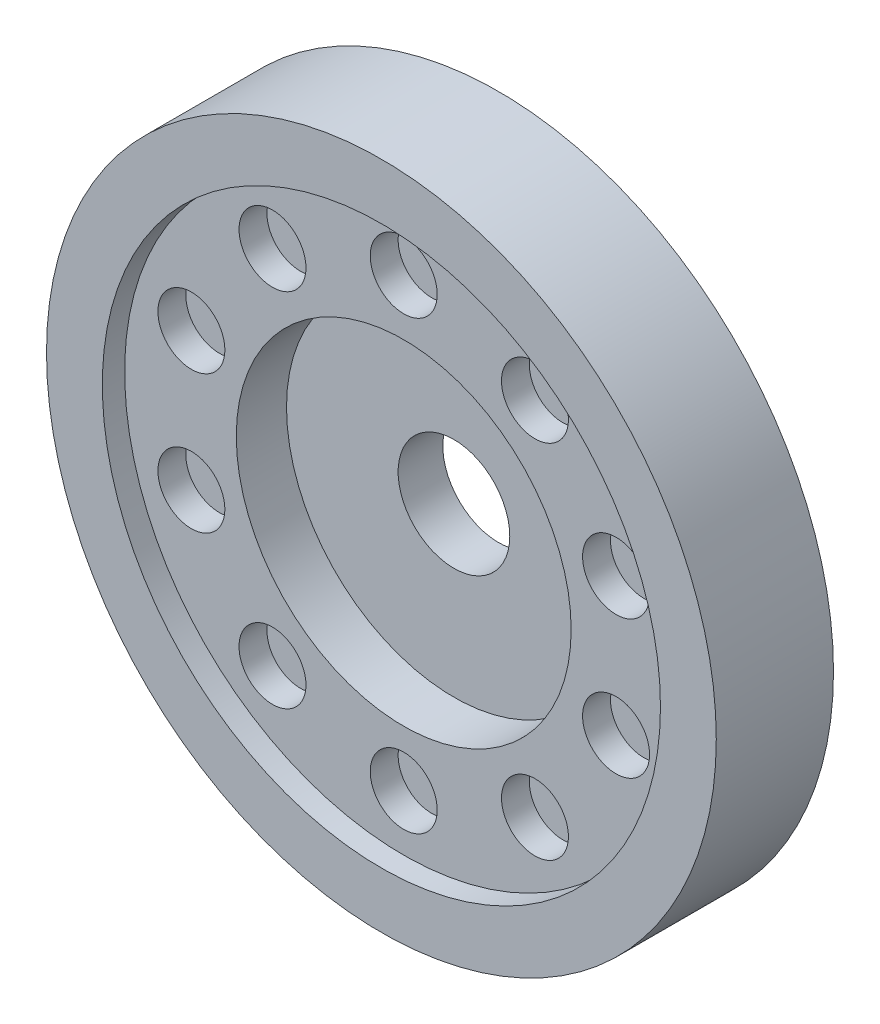
ISO-10303-21;
HEADER;
FILE_DESCRIPTION(('STEP AP214'),'2;1');
FILE_NAME('part.step','',(''),(''),'','','');
FILE_SCHEMA(('AUTOMOTIVE_DESIGN { 1 0 10303 214 1 1 1 1 }'));
ENDSEC;
DATA;
#1=APPLICATION_CONTEXT('core data for automotive mechanical design processes');
#2=APPLICATION_PROTOCOL_DEFINITION('international standard','automotive_design',2000,#1);
#3=PRODUCT_CONTEXT('',#1,'mechanical');
#4=PRODUCT('Part','Part','',(#3));
#5=PRODUCT_RELATED_PRODUCT_CATEGORY('part','',(#4));
#6=PRODUCT_DEFINITION_FORMATION('','',#4);
#7=PRODUCT_DEFINITION_CONTEXT('part definition',#1,'design');
#8=PRODUCT_DEFINITION('design','',#6,#7);
#9=PRODUCT_DEFINITION_SHAPE('','',#8);
#10=(LENGTH_UNIT() NAMED_UNIT(*) SI_UNIT(.MILLI.,.METRE.));
#11=(NAMED_UNIT(*) PLANE_ANGLE_UNIT() SI_UNIT($,.RADIAN.));
#12=(NAMED_UNIT(*) SI_UNIT($,.STERADIAN.) SOLID_ANGLE_UNIT());
#13=UNCERTAINTY_MEASURE_WITH_UNIT(LENGTH_MEASURE(1.E-05),#10,'distance_accuracy_value','');
#14=(GEOMETRIC_REPRESENTATION_CONTEXT(3) GLOBAL_UNCERTAINTY_ASSIGNED_CONTEXT((#13)) GLOBAL_UNIT_ASSIGNED_CONTEXT((#10,
#11,#12)) REPRESENTATION_CONTEXT('',''));
#15=CARTESIAN_POINT('',(0.,0.,0.));
#16=DIRECTION('',(0.,0.,1.));
#17=DIRECTION('',(1.,0.,0.));
#18=AXIS2_PLACEMENT_3D('',#15,#16,#17);
#19=CARTESIAN_POINT('',(0.,0.,0.));
#20=DIRECTION('',(0.,0.,1.));
#21=DIRECTION('',(1.,0.,0.));
#22=AXIS2_PLACEMENT_3D('',#19,#20,#21);
#23=CYLINDRICAL_SURFACE('',#22,63.5);
#24=CARTESIAN_POINT('',(0.,0.,0.));
#25=DIRECTION('',(0.,0.,1.));
#26=DIRECTION('',(1.,0.,0.));
#27=AXIS2_PLACEMENT_3D('',#24,#25,#26);
#28=CIRCLE('',#27,63.5);
#29=CARTESIAN_POINT('',(63.5,0.,0.));
#30=VERTEX_POINT('',#29);
#31=EDGE_CURVE('E58',#30,#30,#28,.T.);
#32=ORIENTED_EDGE('',*,*,#31,.F.);
#33=EDGE_LOOP('',(#32));
#34=FACE_BOUND('',#33,.T.);
#35=CARTESIAN_POINT('',(0.,0.,50.8));
#36=DIRECTION('',(0.,0.,1.));
#37=DIRECTION('',(1.,0.,0.));
#38=AXIS2_PLACEMENT_3D('',#35,#36,#37);
#39=CIRCLE('',#38,63.5);
#40=CARTESIAN_POINT('',(63.5,0.,50.8));
#41=VERTEX_POINT('',#40);
#42=EDGE_CURVE('E67',#41,#41,#39,.F.);
#43=ORIENTED_EDGE('',*,*,#42,.F.);
#44=EDGE_LOOP('',(#43));
#45=FACE_BOUND('',#44,.T.);
#46=ADVANCED_FACE('F43',(#34,#45),#23,.F.);
#47=CARTESIAN_POINT('',(0.,0.,133.35));
#48=DIRECTION('',(0.,0.,-1.));
#49=DIRECTION('',(-1.,0.,0.));
#50=AXIS2_PLACEMENT_3D('',#47,#48,#49);
#51=CYLINDRICAL_SURFACE('',#50,381.);
#52=CARTESIAN_POINT('',(0.,0.,133.35));
#53=DIRECTION('',(0.,0.,1.));
#54=DIRECTION('',(1.,0.,0.));
#55=AXIS2_PLACEMENT_3D('',#52,#53,#54);
#56=CIRCLE('',#55,381.);
#57=CARTESIAN_POINT('',(381.,0.,133.35));
#58=VERTEX_POINT('',#57);
#59=EDGE_CURVE('E10',#58,#58,#56,.T.);
#60=ORIENTED_EDGE('',*,*,#59,.F.);
#61=EDGE_LOOP('',(#60));
#62=FACE_BOUND('',#61,.T.);
#63=CARTESIAN_POINT('',(0.,0.,0.));
#64=DIRECTION('',(0.,0.,1.));
#65=DIRECTION('',(1.,0.,0.));
#66=AXIS2_PLACEMENT_3D('',#63,#64,#65);
#67=CIRCLE('',#66,381.);
#68=CARTESIAN_POINT('',(381.,0.,0.));
#69=VERTEX_POINT('',#68);
#70=EDGE_CURVE('E52',#69,#69,#67,.T.);
#71=ORIENTED_EDGE('',*,*,#70,.T.);
#72=EDGE_LOOP('',(#71));
#73=FACE_BOUND('',#72,.T.);
#74=ADVANCED_FACE('F45',(#62,#73),#51,.T.);
#75=CARTESIAN_POINT('',(0.,0.,133.35));
#76=DIRECTION('',(0.,0.,1.));
#77=DIRECTION('',(1.,0.,0.));
#78=AXIS2_PLACEMENT_3D('',#75,#76,#77);
#79=PLANE('',#78);
#80=CARTESIAN_POINT('',(0.,0.,133.35));
#81=DIRECTION('',(0.,0.,1.));
#82=DIRECTION('',(1.,0.,0.));
#83=AXIS2_PLACEMENT_3D('',#80,#81,#82);
#84=CIRCLE('',#83,317.5);
#85=CARTESIAN_POINT('',(317.5,0.,133.35));
#86=VERTEX_POINT('',#85);
#87=EDGE_CURVE('E72',#86,#86,#84,.T.);
#88=ORIENTED_EDGE('',*,*,#87,.F.);
#89=EDGE_LOOP('',(#88));
#90=FACE_BOUND('',#89,.T.);
#91=ORIENTED_EDGE('',*,*,#59,.T.);
#92=EDGE_LOOP('',(#91));
#93=FACE_BOUND('',#92,.T.);
#94=ADVANCED_FACE('F131',(#90,#93),#79,.T.);
#95=CARTESIAN_POINT('',(0.,0.,0.));
#96=DIRECTION('',(0.,0.,1.));
#97=DIRECTION('',(1.,0.,0.));
#98=AXIS2_PLACEMENT_3D('',#95,#96,#97);
#99=PLANE('',#98);
#100=ORIENTED_EDGE('',*,*,#31,.T.);
#101=EDGE_LOOP('',(#100));
#102=FACE_BOUND('',#101,.T.);
#103=ORIENTED_EDGE('',*,*,#70,.F.);
#104=EDGE_LOOP('',(#103));
#105=FACE_BOUND('',#104,.T.);
#106=ADVANCED_FACE('F133',(#102,#105),#99,.F.);
#107=CARTESIAN_POINT('',(0.,0.,107.95));
#108=DIRECTION('',(0.,0.,1.));
#109=DIRECTION('',(1.,0.,0.));
#110=AXIS2_PLACEMENT_3D('',#107,#108,#109);
#111=PLANE('',#110);
#112=CARTESIAN_POINT('',(149.297454082288,205.490316571236,107.95));
#113=DIRECTION('',(0.,0.,1.));
#114=DIRECTION('',(1.,0.,0.));
#115=AXIS2_PLACEMENT_3D('',#112,#113,#114);
#116=CIRCLE('',#115,38.1);
#117=CARTESIAN_POINT('',(187.397454082289,205.490316571236,107.95));
#118=VERTEX_POINT('',#117);
#119=EDGE_CURVE('E47',#118,#118,#116,.T.);
#120=ORIENTED_EDGE('',*,*,#119,.F.);
#121=EDGE_LOOP('',(#120));
#122=FACE_BOUND('',#121,.T.);
#123=CARTESIAN_POINT('',(241.568355138969,78.490316571236,107.95));
#124=DIRECTION('',(0.,0.,1.));
#125=DIRECTION('',(1.,0.,0.));
#126=AXIS2_PLACEMENT_3D('',#123,#124,#125);
#127=CIRCLE('',#126,38.1);
#128=CARTESIAN_POINT('',(279.668355138969,78.490316571236,107.95));
#129=VERTEX_POINT('',#128);
#130=EDGE_CURVE('E105',#129,#129,#127,.T.);
#131=ORIENTED_EDGE('',*,*,#130,.F.);
#132=EDGE_LOOP('',(#131));
#133=FACE_BOUND('',#132,.T.);
#134=CARTESIAN_POINT('',(241.568355138969,-78.4903165712377,107.95));
#135=DIRECTION('',(0.,0.,1.));
#136=DIRECTION('',(1.,0.,0.));
#137=AXIS2_PLACEMENT_3D('',#134,#135,#136);
#138=CIRCLE('',#137,38.1);
#139=CARTESIAN_POINT('',(279.668355138969,-78.4903165712377,107.95));
#140=VERTEX_POINT('',#139);
#141=EDGE_CURVE('E102',#140,#140,#138,.T.);
#142=ORIENTED_EDGE('',*,*,#141,.F.);
#143=EDGE_LOOP('',(#142));
#144=FACE_BOUND('',#143,.T.);
#145=CARTESIAN_POINT('',(149.297454082287,-205.490316571238,107.95));
#146=DIRECTION('',(0.,0.,1.));
#147=DIRECTION('',(1.,0.,0.));
#148=AXIS2_PLACEMENT_3D('',#145,#146,#147);
#149=CIRCLE('',#148,38.1);
#150=CARTESIAN_POINT('',(187.397454082287,-205.490316571238,107.95));
#151=VERTEX_POINT('',#150);
#152=EDGE_CURVE('E98',#151,#151,#149,.T.);
#153=ORIENTED_EDGE('',*,*,#152,.F.);
#154=EDGE_LOOP('',(#153));
#155=FACE_BOUND('',#154,.T.);
#156=CARTESIAN_POINT('',(-1.77367252013231E-12,-254.,107.95));
#157=DIRECTION('',(0.,0.,1.));
#158=DIRECTION('',(1.,0.,0.));
#159=AXIS2_PLACEMENT_3D('',#156,#157,#158);
#160=CIRCLE('',#159,38.1);
#161=CARTESIAN_POINT('',(38.0999999999982,-254.,107.95));
#162=VERTEX_POINT('',#161);
#163=EDGE_CURVE('E94',#162,#162,#160,.T.);
#164=ORIENTED_EDGE('',*,*,#163,.F.);
#165=EDGE_LOOP('',(#164));
#166=FACE_BOUND('',#165,.T.);
#167=CARTESIAN_POINT('',(-149.29745408229,-205.490316571235,107.95));
#168=DIRECTION('',(0.,0.,1.));
#169=DIRECTION('',(1.,0.,0.));
#170=AXIS2_PLACEMENT_3D('',#167,#168,#169);
#171=CIRCLE('',#170,38.1);
#172=CARTESIAN_POINT('',(-111.19745408229,-205.490316571235,107.95));
#173=VERTEX_POINT('',#172);
#174=EDGE_CURVE('E90',#173,#173,#171,.T.);
#175=ORIENTED_EDGE('',*,*,#174,.F.);
#176=EDGE_LOOP('',(#175));
#177=FACE_BOUND('',#176,.T.);
#178=CARTESIAN_POINT('',(-241.56835513897,-78.4903165712343,107.95));
#179=DIRECTION('',(0.,0.,1.));
#180=DIRECTION('',(1.,0.,0.));
#181=AXIS2_PLACEMENT_3D('',#178,#179,#180);
#182=CIRCLE('',#181,38.1);
#183=CARTESIAN_POINT('',(-203.46835513897,-78.4903165712343,107.95));
#184=VERTEX_POINT('',#183);
#185=EDGE_CURVE('E86',#184,#184,#182,.T.);
#186=ORIENTED_EDGE('',*,*,#185,.F.);
#187=EDGE_LOOP('',(#186));
#188=FACE_BOUND('',#187,.T.);
#189=CARTESIAN_POINT('',(-241.568355138968,78.4903165712394,107.95));
#190=DIRECTION('',(0.,0.,1.));
#191=DIRECTION('',(1.,0.,0.));
#192=AXIS2_PLACEMENT_3D('',#189,#190,#191);
#193=CIRCLE('',#192,38.1);
#194=CARTESIAN_POINT('',(-203.468355138968,78.4903165712394,107.95));
#195=VERTEX_POINT('',#194);
#196=EDGE_CURVE('E82',#195,#195,#193,.T.);
#197=ORIENTED_EDGE('',*,*,#196,.F.);
#198=EDGE_LOOP('',(#197));
#199=FACE_BOUND('',#198,.T.);
#200=CARTESIAN_POINT('',(-149.297454082285,205.490316571239,107.95));
#201=DIRECTION('',(0.,0.,1.));
#202=DIRECTION('',(1.,0.,0.));
#203=AXIS2_PLACEMENT_3D('',#200,#201,#202);
#204=CIRCLE('',#203,38.1);
#205=CARTESIAN_POINT('',(-111.197454082285,205.490316571239,107.95));
#206=VERTEX_POINT('',#205);
#207=EDGE_CURVE('E77',#206,#206,#204,.T.);
#208=ORIENTED_EDGE('',*,*,#207,.F.);
#209=EDGE_LOOP('',(#208));
#210=FACE_BOUND('',#209,.T.);
#211=CARTESIAN_POINT('',(0.,254.,107.95));
#212=DIRECTION('',(0.,0.,1.));
#213=DIRECTION('',(1.,0.,0.));
#214=AXIS2_PLACEMENT_3D('',#211,#212,#213);
#215=CIRCLE('',#214,38.1);
#216=CARTESIAN_POINT('',(38.1,254.,107.95));
#217=VERTEX_POINT('',#216);
#218=EDGE_CURVE('E73',#217,#217,#215,.T.);
#219=ORIENTED_EDGE('',*,*,#218,.F.);
#220=EDGE_LOOP('',(#219));
#221=FACE_BOUND('',#220,.T.);
#222=CARTESIAN_POINT('',(0.,0.,107.95));
#223=DIRECTION('',(0.,0.,1.));
#224=DIRECTION('',(1.,0.,0.));
#225=AXIS2_PLACEMENT_3D('',#222,#223,#224);
#226=CIRCLE('',#225,190.5);
#227=CARTESIAN_POINT('',(190.5,0.,107.95));
#228=VERTEX_POINT('',#227);
#229=EDGE_CURVE('E63',#228,#228,#226,.T.);
#230=ORIENTED_EDGE('',*,*,#229,.F.);
#231=EDGE_LOOP('',(#230));
#232=FACE_BOUND('',#231,.T.);
#233=CARTESIAN_POINT('',(0.,0.,107.95));
#234=DIRECTION('',(0.,0.,1.));
#235=DIRECTION('',(1.,0.,0.));
#236=AXIS2_PLACEMENT_3D('',#233,#234,#235);
#237=CIRCLE('',#236,317.5);
#238=CARTESIAN_POINT('',(317.5,0.,107.95));
#239=VERTEX_POINT('',#238);
#240=EDGE_CURVE('E122',#239,#239,#237,.T.);
#241=ORIENTED_EDGE('',*,*,#240,.T.);
#242=EDGE_LOOP('',(#241));
#243=FACE_BOUND('',#242,.T.);
#244=ADVANCED_FACE('F139',(#122,#133,#144,#155,#166,#177,#188,#199,#210,#221,#232,#243),#111,.T.);
#245=CARTESIAN_POINT('',(0.,0.,107.95));
#246=DIRECTION('',(0.,0.,1.));
#247=DIRECTION('',(1.,0.,0.));
#248=AXIS2_PLACEMENT_3D('',#245,#246,#247);
#249=CYLINDRICAL_SURFACE('',#248,317.5);
#250=ORIENTED_EDGE('',*,*,#240,.F.);
#251=EDGE_LOOP('',(#250));
#252=FACE_BOUND('',#251,.T.);
#253=ORIENTED_EDGE('',*,*,#87,.T.);
#254=EDGE_LOOP('',(#253));
#255=FACE_BOUND('',#254,.T.);
#256=ADVANCED_FACE('F129',(#252,#255),#249,.F.);
#257=CARTESIAN_POINT('',(0.,0.,50.8));
#258=DIRECTION('',(0.,0.,1.));
#259=DIRECTION('',(1.,0.,0.));
#260=AXIS2_PLACEMENT_3D('',#257,#258,#259);
#261=PLANE('',#260);
#262=CARTESIAN_POINT('',(0.,0.,50.8));
#263=DIRECTION('',(0.,0.,1.));
#264=DIRECTION('',(1.,0.,0.));
#265=AXIS2_PLACEMENT_3D('',#262,#263,#264);
#266=CIRCLE('',#265,190.5);
#267=CARTESIAN_POINT('',(190.5,0.,50.8));
#268=VERTEX_POINT('',#267);
#269=EDGE_CURVE('E68',#268,#268,#266,.T.);
#270=ORIENTED_EDGE('',*,*,#269,.T.);
#271=EDGE_LOOP('',(#270));
#272=FACE_BOUND('',#271,.T.);
#273=ORIENTED_EDGE('',*,*,#42,.T.);
#274=EDGE_LOOP('',(#273));
#275=FACE_BOUND('',#274,.T.);
#276=ADVANCED_FACE('F153',(#272,#275),#261,.T.);
#277=CARTESIAN_POINT('',(0.,0.,50.8));
#278=DIRECTION('',(0.,0.,1.));
#279=DIRECTION('',(1.,0.,0.));
#280=AXIS2_PLACEMENT_3D('',#277,#278,#279);
#281=CYLINDRICAL_SURFACE('',#280,190.5);
#282=ORIENTED_EDGE('',*,*,#229,.T.);
#283=EDGE_LOOP('',(#282));
#284=FACE_BOUND('',#283,.T.);
#285=ORIENTED_EDGE('',*,*,#269,.F.);
#286=EDGE_LOOP('',(#285));
#287=FACE_BOUND('',#286,.T.);
#288=ADVANCED_FACE('F158',(#284,#287),#281,.F.);
#289=CARTESIAN_POINT('',(0.,254.,76.2));
#290=DIRECTION('',(0.,0.,1.));
#291=DIRECTION('',(1.,0.,0.));
#292=AXIS2_PLACEMENT_3D('',#289,#290,#291);
#293=CYLINDRICAL_SURFACE('',#292,38.1);
#294=ORIENTED_EDGE('',*,*,#218,.T.);
#295=EDGE_LOOP('',(#294));
#296=FACE_BOUND('',#295,.T.);
#297=CARTESIAN_POINT('',(0.,254.,76.2));
#298=DIRECTION('',(0.,0.,1.));
#299=DIRECTION('',(1.,0.,0.));
#300=AXIS2_PLACEMENT_3D('',#297,#298,#299);
#301=CIRCLE('',#300,38.1);
#302=CARTESIAN_POINT('',(38.1,254.,76.2));
#303=VERTEX_POINT('',#302);
#304=EDGE_CURVE('E78',#303,#303,#301,.T.);
#305=ORIENTED_EDGE('',*,*,#304,.F.);
#306=EDGE_LOOP('',(#305));
#307=FACE_BOUND('',#306,.T.);
#308=ADVANCED_FACE('F161',(#296,#307),#293,.F.);
#309=CARTESIAN_POINT('',(0.,254.,76.2));
#310=DIRECTION('',(0.,0.,1.));
#311=DIRECTION('',(1.,0.,0.));
#312=AXIS2_PLACEMENT_3D('',#309,#310,#311);
#313=PLANE('',#312);
#314=ORIENTED_EDGE('',*,*,#304,.T.);
#315=EDGE_LOOP('',(#314));
#316=FACE_BOUND('',#315,.T.);
#317=ADVANCED_FACE('F166',(#316),#313,.T.);
#318=CARTESIAN_POINT('',(-149.297454082285,205.490316571239,76.2));
#319=DIRECTION('',(0.,0.,1.));
#320=DIRECTION('',(1.,0.,0.));
#321=AXIS2_PLACEMENT_3D('',#318,#319,#320);
#322=CYLINDRICAL_SURFACE('',#321,38.1);
#323=ORIENTED_EDGE('',*,*,#207,.T.);
#324=EDGE_LOOP('',(#323));
#325=FACE_BOUND('',#324,.T.);
#326=CARTESIAN_POINT('',(-149.297454082285,205.490316571239,76.2));
#327=DIRECTION('',(0.,0.,1.));
#328=DIRECTION('',(1.,0.,0.));
#329=AXIS2_PLACEMENT_3D('',#326,#327,#328);
#330=CIRCLE('',#329,38.1);
#331=CARTESIAN_POINT('',(-111.197454082285,205.490316571239,76.2));
#332=VERTEX_POINT('',#331);
#333=EDGE_CURVE('E246',#332,#332,#330,.T.);
#334=ORIENTED_EDGE('',*,*,#333,.F.);
#335=EDGE_LOOP('',(#334));
#336=FACE_BOUND('',#335,.T.);
#337=ADVANCED_FACE('F170',(#325,#336),#322,.F.);
#338=CARTESIAN_POINT('',(-149.297454082285,205.490316571239,76.2));
#339=DIRECTION('',(0.,0.,1.));
#340=DIRECTION('',(1.,0.,0.));
#341=AXIS2_PLACEMENT_3D('',#338,#339,#340);
#342=PLANE('',#341);
#343=ORIENTED_EDGE('',*,*,#333,.T.);
#344=EDGE_LOOP('',(#343));
#345=FACE_BOUND('',#344,.T.);
#346=ADVANCED_FACE('F180',(#345),#342,.T.);
#347=CARTESIAN_POINT('',(-241.568355138968,78.4903165712394,76.2));
#348=DIRECTION('',(0.,0.,1.));
#349=DIRECTION('',(1.,0.,0.));
#350=AXIS2_PLACEMENT_3D('',#347,#348,#349);
#351=CYLINDRICAL_SURFACE('',#350,38.1);
#352=ORIENTED_EDGE('',*,*,#196,.T.);
#353=EDGE_LOOP('',(#352));
#354=FACE_BOUND('',#353,.T.);
#355=CARTESIAN_POINT('',(-241.568355138968,78.4903165712394,76.2));
#356=DIRECTION('',(0.,0.,1.));
#357=DIRECTION('',(1.,0.,0.));
#358=AXIS2_PLACEMENT_3D('',#355,#356,#357);
#359=CIRCLE('',#358,38.1);
#360=CARTESIAN_POINT('',(-203.468355138968,78.4903165712394,76.2));
#361=VERTEX_POINT('',#360);
#362=EDGE_CURVE('E248',#361,#361,#359,.T.);
#363=ORIENTED_EDGE('',*,*,#362,.F.);
#364=EDGE_LOOP('',(#363));
#365=FACE_BOUND('',#364,.T.);
#366=ADVANCED_FACE('F176',(#354,#365),#351,.F.);
#367=CARTESIAN_POINT('',(-241.568355138968,78.4903165712394,76.2));
#368=DIRECTION('',(0.,0.,1.));
#369=DIRECTION('',(1.,0.,0.));
#370=AXIS2_PLACEMENT_3D('',#367,#368,#369);
#371=PLANE('',#370);
#372=ORIENTED_EDGE('',*,*,#362,.T.);
#373=EDGE_LOOP('',(#372));
#374=FACE_BOUND('',#373,.T.);
#375=ADVANCED_FACE('F172',(#374),#371,.T.);
#376=CARTESIAN_POINT('',(-241.56835513897,-78.4903165712343,76.2));
#377=DIRECTION('',(0.,0.,1.));
#378=DIRECTION('',(1.,0.,0.));
#379=AXIS2_PLACEMENT_3D('',#376,#377,#378);
#380=CYLINDRICAL_SURFACE('',#379,38.1);
#381=ORIENTED_EDGE('',*,*,#185,.T.);
#382=EDGE_LOOP('',(#381));
#383=FACE_BOUND('',#382,.T.);
#384=CARTESIAN_POINT('',(-241.56835513897,-78.4903165712343,76.2));
#385=DIRECTION('',(0.,0.,1.));
#386=DIRECTION('',(1.,0.,0.));
#387=AXIS2_PLACEMENT_3D('',#384,#385,#386);
#388=CIRCLE('',#387,38.1);
#389=CARTESIAN_POINT('',(-203.46835513897,-78.4903165712343,76.2));
#390=VERTEX_POINT('',#389);
#391=EDGE_CURVE('E252',#390,#390,#388,.T.);
#392=ORIENTED_EDGE('',*,*,#391,.F.);
#393=EDGE_LOOP('',(#392));
#394=FACE_BOUND('',#393,.T.);
#395=ADVANCED_FACE('F175',(#383,#394),#380,.F.);
#396=CARTESIAN_POINT('',(-241.56835513897,-78.4903165712343,76.2));
#397=DIRECTION('',(0.,0.,1.));
#398=DIRECTION('',(1.,0.,0.));
#399=AXIS2_PLACEMENT_3D('',#396,#397,#398);
#400=PLANE('',#399);
#401=ORIENTED_EDGE('',*,*,#391,.T.);
#402=EDGE_LOOP('',(#401));
#403=FACE_BOUND('',#402,.T.);
#404=ADVANCED_FACE('F182',(#403),#400,.T.);
#405=CARTESIAN_POINT('',(-149.29745408229,-205.490316571235,76.2));
#406=DIRECTION('',(0.,0.,1.));
#407=DIRECTION('',(1.,0.,0.));
#408=AXIS2_PLACEMENT_3D('',#405,#406,#407);
#409=CYLINDRICAL_SURFACE('',#408,38.1);
#410=ORIENTED_EDGE('',*,*,#174,.T.);
#411=EDGE_LOOP('',(#410));
#412=FACE_BOUND('',#411,.T.);
#413=CARTESIAN_POINT('',(-149.29745408229,-205.490316571235,76.2));
#414=DIRECTION('',(0.,0.,1.));
#415=DIRECTION('',(1.,0.,0.));
#416=AXIS2_PLACEMENT_3D('',#413,#414,#415);
#417=CIRCLE('',#416,38.1);
#418=CARTESIAN_POINT('',(-111.19745408229,-205.490316571235,76.2));
#419=VERTEX_POINT('',#418);
#420=EDGE_CURVE('E274',#419,#419,#417,.T.);
#421=ORIENTED_EDGE('',*,*,#420,.F.);
#422=EDGE_LOOP('',(#421));
#423=FACE_BOUND('',#422,.T.);
#424=ADVANCED_FACE('F185',(#412,#423),#409,.F.);
#425=CARTESIAN_POINT('',(-149.29745408229,-205.490316571235,76.2));
#426=DIRECTION('',(0.,0.,1.));
#427=DIRECTION('',(1.,0.,0.));
#428=AXIS2_PLACEMENT_3D('',#425,#426,#427);
#429=PLANE('',#428);
#430=ORIENTED_EDGE('',*,*,#420,.T.);
#431=EDGE_LOOP('',(#430));
#432=FACE_BOUND('',#431,.T.);
#433=ADVANCED_FACE('F190',(#432),#429,.T.);
#434=CARTESIAN_POINT('',(-1.77367252013231E-12,-254.,76.2));
#435=DIRECTION('',(0.,0.,1.));
#436=DIRECTION('',(1.,0.,0.));
#437=AXIS2_PLACEMENT_3D('',#434,#435,#436);
#438=CYLINDRICAL_SURFACE('',#437,38.1);
#439=ORIENTED_EDGE('',*,*,#163,.T.);
#440=EDGE_LOOP('',(#439));
#441=FACE_BOUND('',#440,.T.);
#442=CARTESIAN_POINT('',(-1.77367252013231E-12,-254.,76.2));
#443=DIRECTION('',(0.,0.,1.));
#444=DIRECTION('',(1.,0.,0.));
#445=AXIS2_PLACEMENT_3D('',#442,#443,#444);
#446=CIRCLE('',#445,38.1);
#447=CARTESIAN_POINT('',(38.0999999999982,-254.,76.2));
#448=VERTEX_POINT('',#447);
#449=EDGE_CURVE('E270',#448,#448,#446,.T.);
#450=ORIENTED_EDGE('',*,*,#449,.F.);
#451=EDGE_LOOP('',(#450));
#452=FACE_BOUND('',#451,.T.);
#453=ADVANCED_FACE('F193',(#441,#452),#438,.F.);
#454=CARTESIAN_POINT('',(-1.77367252013231E-12,-254.,76.2));
#455=DIRECTION('',(0.,0.,1.));
#456=DIRECTION('',(1.,0.,0.));
#457=AXIS2_PLACEMENT_3D('',#454,#455,#456);
#458=PLANE('',#457);
#459=ORIENTED_EDGE('',*,*,#449,.T.);
#460=EDGE_LOOP('',(#459));
#461=FACE_BOUND('',#460,.T.);
#462=ADVANCED_FACE('F198',(#461),#458,.T.);
#463=CARTESIAN_POINT('',(149.297454082287,-205.490316571238,76.2));
#464=DIRECTION('',(0.,0.,1.));
#465=DIRECTION('',(1.,0.,0.));
#466=AXIS2_PLACEMENT_3D('',#463,#464,#465);
#467=CYLINDRICAL_SURFACE('',#466,38.1);
#468=ORIENTED_EDGE('',*,*,#152,.T.);
#469=EDGE_LOOP('',(#468));
#470=FACE_BOUND('',#469,.T.);
#471=CARTESIAN_POINT('',(149.297454082287,-205.490316571238,76.2));
#472=DIRECTION('',(0.,0.,1.));
#473=DIRECTION('',(1.,0.,0.));
#474=AXIS2_PLACEMENT_3D('',#471,#472,#473);
#475=CIRCLE('',#474,38.1);
#476=CARTESIAN_POINT('',(187.397454082287,-205.490316571238,76.2));
#477=VERTEX_POINT('',#476);
#478=EDGE_CURVE('E266',#477,#477,#475,.T.);
#479=ORIENTED_EDGE('',*,*,#478,.F.);
#480=EDGE_LOOP('',(#479));
#481=FACE_BOUND('',#480,.T.);
#482=ADVANCED_FACE('F201',(#470,#481),#467,.F.);
#483=CARTESIAN_POINT('',(149.297454082287,-205.490316571238,76.2));
#484=DIRECTION('',(0.,0.,1.));
#485=DIRECTION('',(1.,0.,0.));
#486=AXIS2_PLACEMENT_3D('',#483,#484,#485);
#487=PLANE('',#486);
#488=ORIENTED_EDGE('',*,*,#478,.T.);
#489=EDGE_LOOP('',(#488));
#490=FACE_BOUND('',#489,.T.);
#491=ADVANCED_FACE('F206',(#490),#487,.T.);
#492=CARTESIAN_POINT('',(241.568355138969,-78.4903165712377,76.2));
#493=DIRECTION('',(0.,0.,1.));
#494=DIRECTION('',(1.,0.,0.));
#495=AXIS2_PLACEMENT_3D('',#492,#493,#494);
#496=CYLINDRICAL_SURFACE('',#495,38.1);
#497=ORIENTED_EDGE('',*,*,#141,.T.);
#498=EDGE_LOOP('',(#497));
#499=FACE_BOUND('',#498,.T.);
#500=CARTESIAN_POINT('',(241.568355138969,-78.4903165712377,76.2));
#501=DIRECTION('',(0.,0.,1.));
#502=DIRECTION('',(1.,0.,0.));
#503=AXIS2_PLACEMENT_3D('',#500,#501,#502);
#504=CIRCLE('',#503,38.1);
#505=CARTESIAN_POINT('',(279.668355138969,-78.4903165712377,76.2));
#506=VERTEX_POINT('',#505);
#507=EDGE_CURVE('E262',#506,#506,#504,.T.);
#508=ORIENTED_EDGE('',*,*,#507,.F.);
#509=EDGE_LOOP('',(#508));
#510=FACE_BOUND('',#509,.T.);
#511=ADVANCED_FACE('F209',(#499,#510),#496,.F.);
#512=CARTESIAN_POINT('',(241.568355138969,-78.4903165712377,76.2));
#513=DIRECTION('',(0.,0.,1.));
#514=DIRECTION('',(1.,0.,0.));
#515=AXIS2_PLACEMENT_3D('',#512,#513,#514);
#516=PLANE('',#515);
#517=ORIENTED_EDGE('',*,*,#507,.T.);
#518=EDGE_LOOP('',(#517));
#519=FACE_BOUND('',#518,.T.);
#520=ADVANCED_FACE('F214',(#519),#516,.T.);
#521=CARTESIAN_POINT('',(241.568355138969,78.490316571236,76.2));
#522=DIRECTION('',(0.,0.,1.));
#523=DIRECTION('',(1.,0.,0.));
#524=AXIS2_PLACEMENT_3D('',#521,#522,#523);
#525=CYLINDRICAL_SURFACE('',#524,38.1);
#526=ORIENTED_EDGE('',*,*,#130,.T.);
#527=EDGE_LOOP('',(#526));
#528=FACE_BOUND('',#527,.T.);
#529=CARTESIAN_POINT('',(241.568355138969,78.490316571236,76.2));
#530=DIRECTION('',(0.,0.,1.));
#531=DIRECTION('',(1.,0.,0.));
#532=AXIS2_PLACEMENT_3D('',#529,#530,#531);
#533=CIRCLE('',#532,38.1);
#534=CARTESIAN_POINT('',(279.668355138969,78.490316571236,76.2));
#535=VERTEX_POINT('',#534);
#536=EDGE_CURVE('E258',#535,#535,#533,.T.);
#537=ORIENTED_EDGE('',*,*,#536,.F.);
#538=EDGE_LOOP('',(#537));
#539=FACE_BOUND('',#538,.T.);
#540=ADVANCED_FACE('F217',(#528,#539),#525,.F.);
#541=CARTESIAN_POINT('',(241.568355138969,78.490316571236,76.2));
#542=DIRECTION('',(0.,0.,1.));
#543=DIRECTION('',(1.,0.,0.));
#544=AXIS2_PLACEMENT_3D('',#541,#542,#543);
#545=PLANE('',#544);
#546=ORIENTED_EDGE('',*,*,#536,.T.);
#547=EDGE_LOOP('',(#546));
#548=FACE_BOUND('',#547,.T.);
#549=ADVANCED_FACE('F222',(#548),#545,.T.);
#550=CARTESIAN_POINT('',(149.297454082288,205.490316571236,76.2));
#551=DIRECTION('',(0.,0.,1.));
#552=DIRECTION('',(1.,0.,0.));
#553=AXIS2_PLACEMENT_3D('',#550,#551,#552);
#554=CYLINDRICAL_SURFACE('',#553,38.1);
#555=ORIENTED_EDGE('',*,*,#119,.T.);
#556=EDGE_LOOP('',(#555));
#557=FACE_BOUND('',#556,.T.);
#558=CARTESIAN_POINT('',(149.297454082288,205.490316571236,76.2));
#559=DIRECTION('',(0.,0.,1.));
#560=DIRECTION('',(1.,0.,0.));
#561=AXIS2_PLACEMENT_3D('',#558,#559,#560);
#562=CIRCLE('',#561,38.1);
#563=CARTESIAN_POINT('',(187.397454082289,205.490316571236,76.2));
#564=VERTEX_POINT('',#563);
#565=EDGE_CURVE('E254',#564,#564,#562,.T.);
#566=ORIENTED_EDGE('',*,*,#565,.F.);
#567=EDGE_LOOP('',(#566));
#568=FACE_BOUND('',#567,.T.);
#569=ADVANCED_FACE('F225',(#557,#568),#554,.F.);
#570=CARTESIAN_POINT('',(149.297454082288,205.490316571236,76.2));
#571=DIRECTION('',(0.,0.,1.));
#572=DIRECTION('',(1.,0.,0.));
#573=AXIS2_PLACEMENT_3D('',#570,#571,#572);
#574=PLANE('',#573);
#575=ORIENTED_EDGE('',*,*,#565,.T.);
#576=EDGE_LOOP('',(#575));
#577=FACE_BOUND('',#576,.T.);
#578=ADVANCED_FACE('F229',(#577),#574,.T.);
#579=CLOSED_SHELL('',(#46,#74,#94,#106,#244,#256,#276,#288,#308,#317,#337,#346,#366,#375,#395,
#404,#424,#433,#453,#462,#482,#491,#511,#520,#540,#549,#569,#578));
#580=MANIFOLD_SOLID_BREP('B2',#579);
#581=ADVANCED_BREP_SHAPE_REPRESENTATION('',(#18,#580),#14);
#582=SHAPE_DEFINITION_REPRESENTATION(#9,#581);
ENDSEC;
END-ISO-10303-21;
